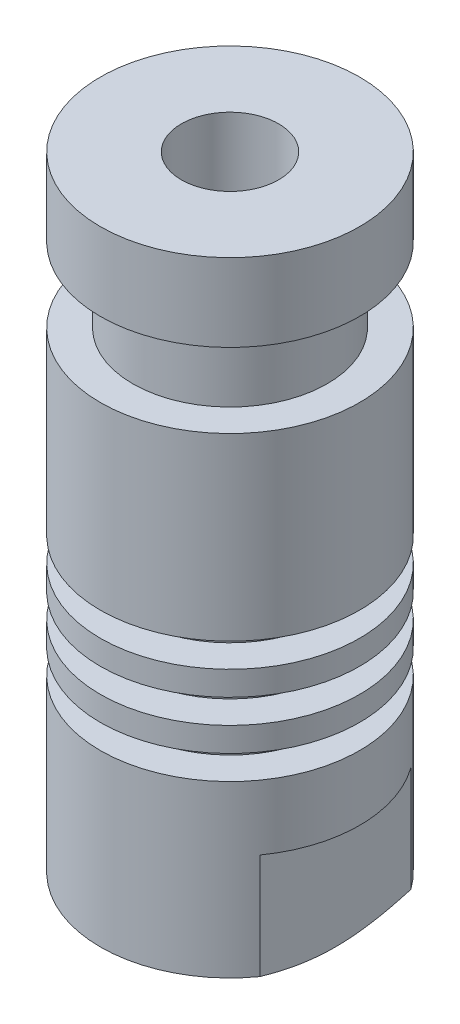
ISO-10303-21;
HEADER;
FILE_DESCRIPTION(('STEP AP214'),'2;1');
FILE_NAME('part.step','',(''),(''),'','','');
FILE_SCHEMA(('AUTOMOTIVE_DESIGN { 1 0 10303 214 1 1 1 1 }'));
ENDSEC;
DATA;
#1=APPLICATION_CONTEXT('core data for automotive mechanical design processes');
#2=APPLICATION_PROTOCOL_DEFINITION('international standard','automotive_design',2000,#1);
#3=PRODUCT_CONTEXT('',#1,'mechanical');
#4=PRODUCT('Part','Part','',(#3));
#5=PRODUCT_RELATED_PRODUCT_CATEGORY('part','',(#4));
#6=PRODUCT_DEFINITION_FORMATION('','',#4);
#7=PRODUCT_DEFINITION_CONTEXT('part definition',#1,'design');
#8=PRODUCT_DEFINITION('design','',#6,#7);
#9=PRODUCT_DEFINITION_SHAPE('','',#8);
#10=(LENGTH_UNIT() NAMED_UNIT(*) SI_UNIT(.MILLI.,.METRE.));
#11=(NAMED_UNIT(*) PLANE_ANGLE_UNIT() SI_UNIT($,.RADIAN.));
#12=(NAMED_UNIT(*) SI_UNIT($,.STERADIAN.) SOLID_ANGLE_UNIT());
#13=UNCERTAINTY_MEASURE_WITH_UNIT(LENGTH_MEASURE(1.E-05),#10,'distance_accuracy_value','');
#14=(GEOMETRIC_REPRESENTATION_CONTEXT(3) GLOBAL_UNCERTAINTY_ASSIGNED_CONTEXT((#13)) GLOBAL_UNIT_ASSIGNED_CONTEXT((#10,
#11,#12)) REPRESENTATION_CONTEXT('',''));
#15=CARTESIAN_POINT('',(0.,0.,0.));
#16=DIRECTION('',(0.,0.,1.));
#17=DIRECTION('',(1.,0.,0.));
#18=AXIS2_PLACEMENT_3D('',#15,#16,#17);
#19=CARTESIAN_POINT('',(0.,1.5,0.));
#20=DIRECTION('',(0.,1.,0.));
#21=DIRECTION('',(0.,0.,1.));
#22=AXIS2_PLACEMENT_3D('',#19,#20,#21);
#23=CONICAL_SURFACE('',#22,7.99999999999999,1.10714871779409);
#24=CARTESIAN_POINT('',(0.,0.,0.));
#25=DIRECTION('',(0.,1.,0.));
#26=DIRECTION('',(0.,0.,1.));
#27=AXIS2_PLACEMENT_3D('',#24,#25,#26);
#28=CIRCLE('',#27,4.99999999999998);
#29=CARTESIAN_POINT('',(0.,0.,4.99999999999998));
#30=VERTEX_POINT('',#29);
#31=EDGE_CURVE('E11',#30,#30,#28,.T.);
#32=ORIENTED_EDGE('',*,*,#31,.T.);
#33=EDGE_LOOP('',(#32));
#34=FACE_BOUND('',#33,.T.);
#35=CARTESIAN_POINT('',(0.,1.5,0.));
#36=DIRECTION('',(0.,1.,0.));
#37=DIRECTION('',(0.,0.,1.));
#38=AXIS2_PLACEMENT_3D('',#35,#36,#37);
#39=CIRCLE('',#38,7.99999999999999);
#40=CARTESIAN_POINT('',(6.49999999999997,1.5,-4.66368952654442));
#41=VERTEX_POINT('',#40);
#42=CARTESIAN_POINT('',(-6.49999999999997,1.5,-4.66368952654442));
#43=VERTEX_POINT('',#42);
#44=EDGE_CURVE('E92',#41,#43,#39,.T.);
#45=ORIENTED_EDGE('',*,*,#44,.F.);
#46=CARTESIAN_POINT('',(6.49999999999999,4.63960517836139,-12.7140020611741));
#47=CARTESIAN_POINT('',(6.49999999999999,4.49493273691476,-12.3889791438294));
#48=CARTESIAN_POINT('',(6.49999999999999,4.35117750702607,-12.0635434352985));
#49=CARTESIAN_POINT('',(6.49999999999999,4.06600795170587,-11.4116234990025));
#50=CARTESIAN_POINT('',(6.49999999999999,3.92459377917146,-11.0851392044028));
#51=CARTESIAN_POINT('',(6.49999999999999,3.64433543055072,-10.4302489102803));
#52=CARTESIAN_POINT('',(6.49999999999999,3.50549732908588,-10.1018403056813));
#53=CARTESIAN_POINT('',(6.49999999999999,3.23142571950738,-9.44352872623451));
#54=CARTESIAN_POINT('',(6.49999999999999,3.09619212071106,-9.11362578922608));
#55=CARTESIAN_POINT('',(6.49999999999999,2.83048289305681,-8.45250376338199));
#56=CARTESIAN_POINT('',(6.49999999999999,2.70000014874712,-8.12128754257229));
#57=CARTESIAN_POINT('',(6.49999999999999,2.44483186701764,-7.45659634827721));
#58=CARTESIAN_POINT('',(6.49999999999999,2.32014667007343,-7.12312124344746));
#59=CARTESIAN_POINT('',(6.49999999999999,2.07840099908305,-6.45372644486896));
#60=CARTESIAN_POINT('',(6.49999999999999,1.96133416663675,-6.11780905674865));
#61=CARTESIAN_POINT('',(6.49999999999999,1.73702665581905,-5.44272397498847));
#62=CARTESIAN_POINT('',(6.49999999999999,1.62978438251793,-5.10355681882979));
#63=CARTESIAN_POINT('',(6.49999999999999,1.50145760944831,-4.66929022803816));
#64=CARTESIAN_POINT('',(6.49999999999999,1.47439812441263,-4.57594563698323));
#65=CARTESIAN_POINT('',(6.49999999999999,1.42132141191772,-4.38896083134469));
#66=CARTESIAN_POINT('',(6.49999999999999,1.39530416853117,-4.29532062130229));
#67=CARTESIAN_POINT('',(6.49999999999999,1.31884649816979,-4.01363447591895));
#68=CARTESIAN_POINT('',(6.49999999999999,1.27009239909997,-3.82513345071698));
#69=CARTESIAN_POINT('',(6.49999999999999,1.13144347216063,-3.25712110004858));
#70=CARTESIAN_POINT('',(6.49999999999999,1.04932049996449,-2.87562365996438));
#71=CARTESIAN_POINT('',(6.49999999999999,0.946261094020701,-2.29977813127616));
#72=CARTESIAN_POINT('',(6.49999999999999,0.915259699355964,-2.10720712065049));
#73=CARTESIAN_POINT('',(6.49999999999999,0.860714592579146,-1.7210183720728));
#74=CARTESIAN_POINT('',(6.49999999999999,0.837170046736164,-1.52740075360301));
#75=CARTESIAN_POINT('',(6.49999999999999,0.798232474629815,-1.13985753736791));
#76=CARTESIAN_POINT('',(6.49999999999999,0.78281812154265,-0.945934097286736));
#77=CARTESIAN_POINT('',(6.49999999999999,0.760510527948946,-0.557594838663115));
#78=CARTESIAN_POINT('',(6.49999999999999,0.753617189046767,-0.363179025832271));
#79=CARTESIAN_POINT('',(6.49999999999999,0.748572275423311,0.0257307608028582));
#80=CARTESIAN_POINT('',(6.49999999999999,0.750419038007415,0.220224712703199));
#81=CARTESIAN_POINT('',(6.49999999999999,0.76278940638265,0.608953775199544));
#82=CARTESIAN_POINT('',(6.49999999999999,0.773314033718197,0.803188852624818));
#83=CARTESIAN_POINT('',(6.49999999999999,0.806501889662758,1.24090602694894));
#84=CARTESIAN_POINT('',(6.49999999999999,0.831590920516132,1.48420561931385));
#85=CARTESIAN_POINT('',(6.49999999999999,0.893852125406738,1.96924724220696));
#86=CARTESIAN_POINT('',(6.49999999999999,0.931025317420885,2.21098913976373));
#87=CARTESIAN_POINT('',(6.49999999999999,1.01604103903786,2.69277716302994));
#88=CARTESIAN_POINT('',(6.49999999999999,1.06389244038228,2.93282170644527));
#89=CARTESIAN_POINT('',(6.49999999999999,1.16871694054054,3.41088019593747));
#90=CARTESIAN_POINT('',(6.49999999999999,1.22568964445531,3.64889422945387));
#91=CARTESIAN_POINT('',(6.49999999999999,1.34820588611418,4.1264246278799));
#92=CARTESIAN_POINT('',(6.49999999999999,1.41386316573231,4.36591159529887));
#93=CARTESIAN_POINT('',(6.49999999999999,1.55170831935892,4.84285142414976));
#94=CARTESIAN_POINT('',(6.49999999999999,1.62389277522808,5.08030527977033));
#95=CARTESIAN_POINT('',(6.49999999999999,1.77367698683179,5.55344813381403));
#96=CARTESIAN_POINT('',(6.49999999999999,1.85127585874315,5.78913741335531));
#97=CARTESIAN_POINT('',(6.49999999999999,2.01097599435672,6.2590172847031));
#98=CARTESIAN_POINT('',(6.49999999999999,2.09307790629008,6.49320765528824));
#99=CARTESIAN_POINT('',(6.49999999999999,2.28703034641471,7.03262988490792));
#100=CARTESIAN_POINT('',(6.49999999999999,2.40021373679549,7.33738166221177));
#101=CARTESIAN_POINT('',(6.49999999999999,2.63161506867892,7.94497276131788));
#102=CARTESIAN_POINT('',(6.49999999999999,2.74983321640616,8.24781200419785));
#103=CARTESIAN_POINT('',(6.49999999999999,2.99028703034095,8.8519169939098));
#104=CARTESIAN_POINT('',(6.49999999999999,3.11252303289466,9.15318260654962));
#105=CARTESIAN_POINT('',(6.49999999999999,3.36022795848007,9.75438363657073));
#106=CARTESIAN_POINT('',(6.49999999999999,3.4856969285348,10.0543190345298));
#107=CARTESIAN_POINT('',(6.49999999999999,3.8662108131295,10.9529295272112));
#108=CARTESIAN_POINT('',(6.49999999999999,4.12517530296346,11.5499439611486));
#109=CARTESIAN_POINT('',(6.49999999999999,4.65016432189855,12.7407935160942));
#110=CARTESIAN_POINT('',(6.49999999999999,4.91618837224115,13.334628849434));
#111=CARTESIAN_POINT('',(6.49999999999999,5.43683739745572,14.4837436524848));
#112=CARTESIAN_POINT('',(6.49999999999999,5.69116368566189,15.0391586745477));
#113=CARTESIAN_POINT('',(6.49999999999999,6.20312748367828,16.148471829484));
#114=CARTESIAN_POINT('',(6.49999999999999,6.46076506083453,16.7023699312269));
#115=CARTESIAN_POINT('',(6.49999999999999,6.97809934492668,17.8080180985776));
#116=CARTESIAN_POINT('',(6.49999999999999,7.23779164660991,18.3597702278274));
#117=CARTESIAN_POINT('',(6.49999999999999,7.75914833515714,19.4623190137403));
#118=CARTESIAN_POINT('',(6.49999999999999,8.02081265352454,20.0131157027799));
#119=CARTESIAN_POINT('',(6.49999999999999,8.28320577924075,20.5635626171586));
#120=B_SPLINE_CURVE_WITH_KNOTS('',3,(#46,#47,#48,#49,#50,#51,#52,#53,#54,#55,#56,#57,#58,#59,
#60,#61,#62,#63,#64,#65,#66,#67,#68,#69,#70,#71,#72,#73,#74,#75,#76,#77,#78,#79,#80,#81,#82,#83,
#84,#85,#86,#87,#88,#89,#90,#91,#92,#93,#94,#95,#96,#97,#98,#99,#100,#101,#102,#103,#104,#105,
#106,#107,#108,#109,#110,#111,#112,#113,#114,#115,#116,#117,#118,#119),.UNSPECIFIED.,.F.,.F.,(4,
2,2,2,2,2,2,2,2,2,2,2,2,2,2,2,2,2,2,2,2,2,2,2,2,2,2,2,2,2,2,2,2,2,2,2,4),(0.,1.06730515758636,
2.13467974924004,3.20431402837474,4.27392137202762,5.34185467005331,6.40985060614333,
7.47694343200912,8.54386271672926,8.83542135077924,9.12697552758702,9.71105511301348,
10.8808525348457,11.4658873460732,12.0508567229673,12.6342839007031,13.2177043413035,
13.8010137979488,14.3843919306593,15.1178129637762,15.8512957967343,16.5853903108169,
17.31945305149,18.0643130987016,18.8087853133975,19.5531362870632,20.2975946957999,
21.2728075860352,22.2480604596634,23.2233951834841,24.1987441014193,26.1509456097113,
28.1030150621006,29.9356240477088,31.7682703646555,33.5977016553135,35.4270696921721),.UNSPECIFIED.);
#121=CARTESIAN_POINT('',(6.49999999999997,1.5,4.66368952654442));
#122=VERTEX_POINT('',#121);
#123=EDGE_CURVE('E77',#122,#41,#120,.F.);
#124=ORIENTED_EDGE('',*,*,#123,.F.);
#125=CARTESIAN_POINT('',(-6.49999999999997,1.5,4.66368952654442));
#126=VERTEX_POINT('',#125);
#127=EDGE_CURVE('E44',#126,#122,#39,.T.);
#128=ORIENTED_EDGE('',*,*,#127,.F.);
#129=CARTESIAN_POINT('',(-6.49999999999999,4.63960517836139,-12.7140020611741));
#130=CARTESIAN_POINT('',(-6.49999999999999,4.49493273691476,-12.3889791438294));
#131=CARTESIAN_POINT('',(-6.49999999999999,4.35117750702607,-12.0635434352985));
#132=CARTESIAN_POINT('',(-6.49999999999999,4.06600795170587,-11.4116234990025));
#133=CARTESIAN_POINT('',(-6.49999999999999,3.92459377917146,-11.0851392044028));
#134=CARTESIAN_POINT('',(-6.49999999999999,3.64433543055072,-10.4302489102803));
#135=CARTESIAN_POINT('',(-6.49999999999999,3.50549732908588,-10.1018403056813));
#136=CARTESIAN_POINT('',(-6.49999999999999,3.23142571950738,-9.44352872623451));
#137=CARTESIAN_POINT('',(-6.49999999999999,3.09619212071106,-9.11362578922608));
#138=CARTESIAN_POINT('',(-6.49999999999999,2.83048289305681,-8.45250376338199));
#139=CARTESIAN_POINT('',(-6.49999999999999,2.70000014874712,-8.12128754257229));
#140=CARTESIAN_POINT('',(-6.49999999999999,2.44483186701764,-7.45659634827721));
#141=CARTESIAN_POINT('',(-6.49999999999999,2.32014667007343,-7.12312124344746));
#142=CARTESIAN_POINT('',(-6.49999999999999,2.07840099908305,-6.45372644486896));
#143=CARTESIAN_POINT('',(-6.49999999999999,1.96133416663675,-6.11780905674865));
#144=CARTESIAN_POINT('',(-6.49999999999999,1.73702665581905,-5.44272397498847));
#145=CARTESIAN_POINT('',(-6.49999999999999,1.62978438251793,-5.10355681882979));
#146=CARTESIAN_POINT('',(-6.49999999999999,1.50145760944831,-4.66929022803816));
#147=CARTESIAN_POINT('',(-6.49999999999999,1.47439812441263,-4.57594563698323));
#148=CARTESIAN_POINT('',(-6.49999999999999,1.42132141191772,-4.38896083134469));
#149=CARTESIAN_POINT('',(-6.49999999999999,1.39530416853117,-4.29532062130229));
#150=CARTESIAN_POINT('',(-6.49999999999999,1.31884649816979,-4.01363447591895));
#151=CARTESIAN_POINT('',(-6.49999999999999,1.27009239909997,-3.82513345071698));
#152=CARTESIAN_POINT('',(-6.49999999999999,1.13144347216063,-3.25712110004858));
#153=CARTESIAN_POINT('',(-6.49999999999999,1.04932049996449,-2.87562365996438));
#154=CARTESIAN_POINT('',(-6.49999999999999,0.946261094020701,-2.29977813127616));
#155=CARTESIAN_POINT('',(-6.49999999999999,0.915259699355964,-2.10720712065049));
#156=CARTESIAN_POINT('',(-6.49999999999999,0.860714592579146,-1.7210183720728));
#157=CARTESIAN_POINT('',(-6.49999999999999,0.837170046736164,-1.52740075360301));
#158=CARTESIAN_POINT('',(-6.49999999999999,0.798232474629815,-1.13985753736791));
#159=CARTESIAN_POINT('',(-6.49999999999999,0.78281812154265,-0.945934097286736));
#160=CARTESIAN_POINT('',(-6.49999999999999,0.760510527948946,-0.557594838663115));
#161=CARTESIAN_POINT('',(-6.49999999999999,0.753617189046767,-0.363179025832271));
#162=CARTESIAN_POINT('',(-6.49999999999999,0.748572275423311,0.0257307608028582));
#163=CARTESIAN_POINT('',(-6.49999999999999,0.750419038007415,0.220224712703199));
#164=CARTESIAN_POINT('',(-6.49999999999999,0.76278940638265,0.608953775199544));
#165=CARTESIAN_POINT('',(-6.49999999999999,0.773314033718197,0.803188852624818));
#166=CARTESIAN_POINT('',(-6.49999999999999,0.806501889662758,1.24090602694894));
#167=CARTESIAN_POINT('',(-6.49999999999999,0.831590920516132,1.48420561931385));
#168=CARTESIAN_POINT('',(-6.49999999999999,0.893852125406738,1.96924724220696));
#169=CARTESIAN_POINT('',(-6.49999999999999,0.931025317420885,2.21098913976373));
#170=CARTESIAN_POINT('',(-6.49999999999999,1.01604103903786,2.69277716302994));
#171=CARTESIAN_POINT('',(-6.49999999999999,1.06389244038228,2.93282170644527));
#172=CARTESIAN_POINT('',(-6.49999999999999,1.16871694054054,3.41088019593747));
#173=CARTESIAN_POINT('',(-6.49999999999999,1.22568964445531,3.64889422945387));
#174=CARTESIAN_POINT('',(-6.49999999999999,1.34820588611418,4.1264246278799));
#175=CARTESIAN_POINT('',(-6.49999999999999,1.41386316573231,4.36591159529887));
#176=CARTESIAN_POINT('',(-6.49999999999999,1.55170831935892,4.84285142414976));
#177=CARTESIAN_POINT('',(-6.49999999999999,1.62389277522808,5.08030527977033));
#178=CARTESIAN_POINT('',(-6.49999999999999,1.77367698683179,5.55344813381403));
#179=CARTESIAN_POINT('',(-6.49999999999999,1.85127585874315,5.78913741335531));
#180=CARTESIAN_POINT('',(-6.49999999999999,2.01097599435672,6.2590172847031));
#181=CARTESIAN_POINT('',(-6.49999999999999,2.09307790629008,6.49320765528824));
#182=CARTESIAN_POINT('',(-6.49999999999999,2.28703034641471,7.03262988490792));
#183=CARTESIAN_POINT('',(-6.49999999999999,2.40021373679549,7.33738166221177));
#184=CARTESIAN_POINT('',(-6.49999999999999,2.63161506867892,7.94497276131788));
#185=CARTESIAN_POINT('',(-6.49999999999999,2.74983321640616,8.24781200419785));
#186=CARTESIAN_POINT('',(-6.49999999999999,2.99028703034095,8.8519169939098));
#187=CARTESIAN_POINT('',(-6.49999999999999,3.11252303289466,9.15318260654962));
#188=CARTESIAN_POINT('',(-6.49999999999999,3.36022795848007,9.75438363657073));
#189=CARTESIAN_POINT('',(-6.49999999999999,3.4856969285348,10.0543190345298));
#190=CARTESIAN_POINT('',(-6.49999999999999,3.8662108131295,10.9529295272112));
#191=CARTESIAN_POINT('',(-6.49999999999999,4.12517530296346,11.5499439611486));
#192=CARTESIAN_POINT('',(-6.49999999999999,4.65016432189855,12.7407935160942));
#193=CARTESIAN_POINT('',(-6.49999999999999,4.91618837224115,13.334628849434));
#194=CARTESIAN_POINT('',(-6.49999999999999,5.43683739745572,14.4837436524848));
#195=CARTESIAN_POINT('',(-6.49999999999999,5.69116368566189,15.0391586745477));
#196=CARTESIAN_POINT('',(-6.49999999999999,6.20312748367828,16.148471829484));
#197=CARTESIAN_POINT('',(-6.49999999999999,6.46076506083453,16.7023699312269));
#198=CARTESIAN_POINT('',(-6.49999999999999,6.97809934492668,17.8080180985776));
#199=CARTESIAN_POINT('',(-6.49999999999999,7.23779164660991,18.3597702278274));
#200=CARTESIAN_POINT('',(-6.49999999999999,7.75914833515714,19.4623190137403));
#201=CARTESIAN_POINT('',(-6.49999999999999,8.02081265352454,20.0131157027799));
#202=CARTESIAN_POINT('',(-6.49999999999999,8.28320577924075,20.5635626171586));
#203=B_SPLINE_CURVE_WITH_KNOTS('',3,(#129,#130,#131,#132,#133,#134,#135,#136,#137,#138,#139,
#140,#141,#142,#143,#144,#145,#146,#147,#148,#149,#150,#151,#152,#153,#154,#155,#156,#157,#158,
#159,#160,#161,#162,#163,#164,#165,#166,#167,#168,#169,#170,#171,#172,#173,#174,#175,#176,#177,
#178,#179,#180,#181,#182,#183,#184,#185,#186,#187,#188,#189,#190,#191,#192,#193,#194,#195,#196,
#197,#198,#199,#200,#201,#202),.UNSPECIFIED.,.F.,.F.,(4,2,2,2,2,2,2,2,2,2,2,2,2,2,2,2,2,2,2,2,2,
2,2,2,2,2,2,2,2,2,2,2,2,2,2,2,4),(0.,1.06730515758636,2.13467974924004,3.20431402837474,
4.27392137202762,5.34185467005331,6.40985060614333,7.47694343200912,8.54386271672926,
8.83542135077924,9.12697552758702,9.71105511301348,10.8808525348457,11.4658873460732,
12.0508567229673,12.6342839007031,13.2177043413035,13.8010137979488,14.3843919306593,
15.1178129637762,15.8512957967343,16.5853903108169,17.31945305149,18.0643130987016,
18.8087853133975,19.5531362870632,20.2975946957999,21.2728075860352,22.2480604596634,
23.2233951834841,24.1987441014193,26.1509456097113,28.1030150621006,29.9356240477088,
31.7682703646555,33.5977016553135,35.4270696921721),.UNSPECIFIED.);
#204=EDGE_CURVE('E97',#43,#126,#203,.T.);
#205=ORIENTED_EDGE('',*,*,#204,.F.);
#206=EDGE_LOOP('',(#45,#124,#128,#205));
#207=FACE_BOUND('',#206,.T.);
#208=ADVANCED_FACE('F35',(#34,#207),#23,.T.);
#209=CARTESIAN_POINT('',(0.,129.407380346339,0.));
#210=DIRECTION('',(0.,1.,0.));
#211=DIRECTION('',(0.,0.,1.));
#212=AXIS2_PLACEMENT_3D('',#209,#210,#211);
#213=CYLINDRICAL_SURFACE('',#212,7.99999999999999);
#214=CARTESIAN_POINT('',(0.,12.,0.));
#215=DIRECTION('',(0.,1.,0.));
#216=DIRECTION('',(0.,0.,1.));
#217=AXIS2_PLACEMENT_3D('',#214,#215,#216);
#218=CIRCLE('',#217,7.99999999999998);
#219=CARTESIAN_POINT('',(0.,12.,7.99999999999998));
#220=VERTEX_POINT('',#219);
#221=EDGE_CURVE('E98',#220,#220,#218,.T.);
#222=ORIENTED_EDGE('',*,*,#221,.F.);
#223=EDGE_LOOP('',(#222));
#224=FACE_BOUND('',#223,.T.);
#225=CARTESIAN_POINT('',(0.,7.99999999999999,0.));
#226=DIRECTION('',(0.,-1.,0.));
#227=DIRECTION('',(0.,0.,-1.));
#228=AXIS2_PLACEMENT_3D('',#225,#226,#227);
#229=CIRCLE('',#228,7.99999999999999);
#230=CARTESIAN_POINT('',(6.49999999999999,7.99999999999999,-4.6636895265444));
#231=VERTEX_POINT('',#230);
#232=CARTESIAN_POINT('',(6.49999999999997,7.99999999999999,4.66368952654442));
#233=VERTEX_POINT('',#232);
#234=EDGE_CURVE('E50',#231,#233,#229,.T.);
#235=ORIENTED_EDGE('',*,*,#234,.F.);
#236=DIRECTION('',(0.,1.,0.));
#237=VECTOR('',#236,1.);
#238=CARTESIAN_POINT('',(6.49999999999997,129.407380346339,-4.66368952654442));
#239=LINE('',#238,#237);
#240=EDGE_CURVE('E80',#231,#41,#239,.F.);
#241=ORIENTED_EDGE('',*,*,#240,.T.);
#242=ORIENTED_EDGE('',*,*,#44,.T.);
#243=DIRECTION('',(0.,1.,0.));
#244=VECTOR('',#243,1.);
#245=CARTESIAN_POINT('',(-6.49999999999997,129.407380346339,-4.66368952654442));
#246=LINE('',#245,#244);
#247=CARTESIAN_POINT('',(-6.49999999999999,7.99999999999999,-4.6636895265444));
#248=VERTEX_POINT('',#247);
#249=EDGE_CURVE('E456',#43,#248,#246,.T.);
#250=ORIENTED_EDGE('',*,*,#249,.T.);
#251=CARTESIAN_POINT('',(0.,7.99999999999998,0.));
#252=DIRECTION('',(0.,-1.,0.));
#253=DIRECTION('',(1.,0.,0.));
#254=AXIS2_PLACEMENT_3D('',#251,#252,#253);
#255=CIRCLE('',#254,7.99999999999999);
#256=CARTESIAN_POINT('',(-6.49999999999999,7.99999999999999,4.6636895265444));
#257=VERTEX_POINT('',#256);
#258=EDGE_CURVE('E457',#257,#248,#255,.T.);
#259=ORIENTED_EDGE('',*,*,#258,.F.);
#260=DIRECTION('',(0.,1.,0.));
#261=VECTOR('',#260,1.);
#262=CARTESIAN_POINT('',(-6.49999999999997,129.407380346339,4.66368952654442));
#263=LINE('',#262,#261);
#264=EDGE_CURVE('E58',#126,#257,#263,.T.);
#265=ORIENTED_EDGE('',*,*,#264,.F.);
#266=ORIENTED_EDGE('',*,*,#127,.T.);
#267=DIRECTION('',(0.,1.,0.));
#268=VECTOR('',#267,1.);
#269=CARTESIAN_POINT('',(6.49999999999997,129.407380346339,4.66368952654442));
#270=LINE('',#269,#268);
#271=EDGE_CURVE('E82',#233,#122,#270,.F.);
#272=ORIENTED_EDGE('',*,*,#271,.F.);
#273=EDGE_LOOP('',(#235,#241,#242,#250,#259,#265,#266,#272));
#274=FACE_BOUND('',#273,.T.);
#275=ADVANCED_FACE('F90',(#224,#274),#213,.T.);
#276=CARTESIAN_POINT('',(0.,0.,0.));
#277=DIRECTION('',(0.,-1.,0.));
#278=DIRECTION('',(0.,0.,-1.));
#279=AXIS2_PLACEMENT_3D('',#276,#277,#278);
#280=PLANE('',#279);
#281=CARTESIAN_POINT('',(0.,0.,0.));
#282=DIRECTION('',(0.,-1.,0.));
#283=DIRECTION('',(0.,0.,-1.));
#284=AXIS2_PLACEMENT_3D('',#281,#282,#283);
#285=CIRCLE('',#284,3.39999999999999);
#286=CARTESIAN_POINT('',(0.,0.,-3.39999999999999));
#287=VERTEX_POINT('',#286);
#288=EDGE_CURVE('E297',#287,#287,#285,.T.);
#289=ORIENTED_EDGE('',*,*,#288,.F.);
#290=EDGE_LOOP('',(#289));
#291=FACE_BOUND('',#290,.T.);
#292=ORIENTED_EDGE('',*,*,#31,.F.);
#293=EDGE_LOOP('',(#292));
#294=FACE_BOUND('',#293,.T.);
#295=ADVANCED_FACE('F37',(#291,#294),#280,.T.);
#296=CARTESIAN_POINT('',(-7.99999999999998,12.,0.));
#297=DIRECTION('',(0.,1.,0.));
#298=DIRECTION('',(0.,0.,1.));
#299=AXIS2_PLACEMENT_3D('',#296,#297,#298);
#300=PLANE('',#299);
#301=ORIENTED_EDGE('',*,*,#221,.T.);
#302=EDGE_LOOP('',(#301));
#303=FACE_BOUND('',#302,.T.);
#304=CARTESIAN_POINT('',(0.,12.,0.));
#305=DIRECTION('',(0.,1.,0.));
#306=DIRECTION('',(0.,0.,1.));
#307=AXIS2_PLACEMENT_3D('',#304,#305,#306);
#308=CIRCLE('',#307,5.99999999999999);
#309=CARTESIAN_POINT('',(0.,12.,5.99999999999999));
#310=VERTEX_POINT('',#309);
#311=EDGE_CURVE('E101',#310,#310,#308,.T.);
#312=ORIENTED_EDGE('',*,*,#311,.F.);
#313=EDGE_LOOP('',(#312));
#314=FACE_BOUND('',#313,.T.);
#315=ADVANCED_FACE('F185',(#303,#314),#300,.T.);
#316=CARTESIAN_POINT('',(0.,129.407380346339,0.));
#317=DIRECTION('',(0.,1.,0.));
#318=DIRECTION('',(0.,0.,1.));
#319=AXIS2_PLACEMENT_3D('',#316,#317,#318);
#320=CYLINDRICAL_SURFACE('',#319,5.99999999999999);
#321=ORIENTED_EDGE('',*,*,#311,.T.);
#322=EDGE_LOOP('',(#321));
#323=FACE_BOUND('',#322,.T.);
#324=CARTESIAN_POINT('',(0.,13.5,0.));
#325=DIRECTION('',(0.,1.,0.));
#326=DIRECTION('',(0.,0.,1.));
#327=AXIS2_PLACEMENT_3D('',#324,#325,#326);
#328=CIRCLE('',#327,5.99999999999999);
#329=CARTESIAN_POINT('',(0.,13.5,5.99999999999999));
#330=VERTEX_POINT('',#329);
#331=EDGE_CURVE('E106',#330,#330,#328,.T.);
#332=ORIENTED_EDGE('',*,*,#331,.F.);
#333=EDGE_LOOP('',(#332));
#334=FACE_BOUND('',#333,.T.);
#335=ADVANCED_FACE('F188',(#323,#334),#320,.T.);
#336=CARTESIAN_POINT('',(-5.99999999999999,13.5,0.));
#337=DIRECTION('',(0.,-1.,0.));
#338=DIRECTION('',(0.,0.,-1.));
#339=AXIS2_PLACEMENT_3D('',#336,#337,#338);
#340=PLANE('',#339);
#341=ORIENTED_EDGE('',*,*,#331,.T.);
#342=EDGE_LOOP('',(#341));
#343=FACE_BOUND('',#342,.T.);
#344=CARTESIAN_POINT('',(0.,13.5,0.));
#345=DIRECTION('',(0.,1.,0.));
#346=DIRECTION('',(0.,0.,1.));
#347=AXIS2_PLACEMENT_3D('',#344,#345,#346);
#348=CIRCLE('',#347,8.);
#349=CARTESIAN_POINT('',(0.,13.5,8.));
#350=VERTEX_POINT('',#349);
#351=EDGE_CURVE('E109',#350,#350,#348,.T.);
#352=ORIENTED_EDGE('',*,*,#351,.F.);
#353=EDGE_LOOP('',(#352));
#354=FACE_BOUND('',#353,.T.);
#355=ADVANCED_FACE('F192',(#343,#354),#340,.T.);
#356=CARTESIAN_POINT('',(0.,129.407380346339,0.));
#357=DIRECTION('',(0.,1.,0.));
#358=DIRECTION('',(0.,0.,1.));
#359=AXIS2_PLACEMENT_3D('',#356,#357,#358);
#360=CYLINDRICAL_SURFACE('',#359,8.);
#361=ORIENTED_EDGE('',*,*,#351,.T.);
#362=EDGE_LOOP('',(#361));
#363=FACE_BOUND('',#362,.T.);
#364=CARTESIAN_POINT('',(0.,15.,0.));
#365=DIRECTION('',(0.,1.,0.));
#366=DIRECTION('',(0.,0.,1.));
#367=AXIS2_PLACEMENT_3D('',#364,#365,#366);
#368=CIRCLE('',#367,8.);
#369=CARTESIAN_POINT('',(0.,15.,8.));
#370=VERTEX_POINT('',#369);
#371=EDGE_CURVE('E112',#370,#370,#368,.T.);
#372=ORIENTED_EDGE('',*,*,#371,.F.);
#373=EDGE_LOOP('',(#372));
#374=FACE_BOUND('',#373,.T.);
#375=ADVANCED_FACE('F196',(#363,#374),#360,.T.);
#376=CARTESIAN_POINT('',(-8.,15.,0.));
#377=DIRECTION('',(0.,1.,0.));
#378=DIRECTION('',(0.,0.,1.));
#379=AXIS2_PLACEMENT_3D('',#376,#377,#378);
#380=PLANE('',#379);
#381=ORIENTED_EDGE('',*,*,#371,.T.);
#382=EDGE_LOOP('',(#381));
#383=FACE_BOUND('',#382,.T.);
#384=CARTESIAN_POINT('',(0.,15.,0.));
#385=DIRECTION('',(0.,1.,0.));
#386=DIRECTION('',(0.,0.,1.));
#387=AXIS2_PLACEMENT_3D('',#384,#385,#386);
#388=CIRCLE('',#387,6.);
#389=CARTESIAN_POINT('',(0.,15.,6.));
#390=VERTEX_POINT('',#389);
#391=EDGE_CURVE('E115',#390,#390,#388,.T.);
#392=ORIENTED_EDGE('',*,*,#391,.F.);
#393=EDGE_LOOP('',(#392));
#394=FACE_BOUND('',#393,.T.);
#395=ADVANCED_FACE('F200',(#383,#394),#380,.T.);
#396=CARTESIAN_POINT('',(0.,129.407380346339,0.));
#397=DIRECTION('',(0.,1.,0.));
#398=DIRECTION('',(0.,0.,1.));
#399=AXIS2_PLACEMENT_3D('',#396,#397,#398);
#400=CYLINDRICAL_SURFACE('',#399,6.);
#401=ORIENTED_EDGE('',*,*,#391,.T.);
#402=EDGE_LOOP('',(#401));
#403=FACE_BOUND('',#402,.T.);
#404=CARTESIAN_POINT('',(0.,16.5,0.));
#405=DIRECTION('',(0.,1.,0.));
#406=DIRECTION('',(0.,0.,1.));
#407=AXIS2_PLACEMENT_3D('',#404,#405,#406);
#408=CIRCLE('',#407,6.);
#409=CARTESIAN_POINT('',(0.,16.5,6.));
#410=VERTEX_POINT('',#409);
#411=EDGE_CURVE('E118',#410,#410,#408,.T.);
#412=ORIENTED_EDGE('',*,*,#411,.F.);
#413=EDGE_LOOP('',(#412));
#414=FACE_BOUND('',#413,.T.);
#415=ADVANCED_FACE('F204',(#403,#414),#400,.T.);
#416=CARTESIAN_POINT('',(-6.,16.5,0.));
#417=DIRECTION('',(0.,-1.,0.));
#418=DIRECTION('',(0.,0.,-1.));
#419=AXIS2_PLACEMENT_3D('',#416,#417,#418);
#420=PLANE('',#419);
#421=ORIENTED_EDGE('',*,*,#411,.T.);
#422=EDGE_LOOP('',(#421));
#423=FACE_BOUND('',#422,.T.);
#424=CARTESIAN_POINT('',(0.,16.5,0.));
#425=DIRECTION('',(0.,1.,0.));
#426=DIRECTION('',(0.,0.,1.));
#427=AXIS2_PLACEMENT_3D('',#424,#425,#426);
#428=CIRCLE('',#427,8.);
#429=CARTESIAN_POINT('',(0.,16.5,8.));
#430=VERTEX_POINT('',#429);
#431=EDGE_CURVE('E121',#430,#430,#428,.T.);
#432=ORIENTED_EDGE('',*,*,#431,.F.);
#433=EDGE_LOOP('',(#432));
#434=FACE_BOUND('',#433,.T.);
#435=ADVANCED_FACE('F208',(#423,#434),#420,.T.);
#436=CARTESIAN_POINT('',(0.,129.407380346339,0.));
#437=DIRECTION('',(0.,1.,0.));
#438=DIRECTION('',(0.,0.,1.));
#439=AXIS2_PLACEMENT_3D('',#436,#437,#438);
#440=CYLINDRICAL_SURFACE('',#439,8.);
#441=ORIENTED_EDGE('',*,*,#431,.T.);
#442=EDGE_LOOP('',(#441));
#443=FACE_BOUND('',#442,.T.);
#444=CARTESIAN_POINT('',(0.,18.,0.));
#445=DIRECTION('',(0.,1.,0.));
#446=DIRECTION('',(0.,0.,1.));
#447=AXIS2_PLACEMENT_3D('',#444,#445,#446);
#448=CIRCLE('',#447,8.);
#449=CARTESIAN_POINT('',(0.,18.,8.));
#450=VERTEX_POINT('',#449);
#451=EDGE_CURVE('E124',#450,#450,#448,.T.);
#452=ORIENTED_EDGE('',*,*,#451,.F.);
#453=EDGE_LOOP('',(#452));
#454=FACE_BOUND('',#453,.T.);
#455=ADVANCED_FACE('F212',(#443,#454),#440,.T.);
#456=CARTESIAN_POINT('',(-8.,18.,0.));
#457=DIRECTION('',(0.,1.,0.));
#458=DIRECTION('',(0.,0.,1.));
#459=AXIS2_PLACEMENT_3D('',#456,#457,#458);
#460=PLANE('',#459);
#461=ORIENTED_EDGE('',*,*,#451,.T.);
#462=EDGE_LOOP('',(#461));
#463=FACE_BOUND('',#462,.T.);
#464=CARTESIAN_POINT('',(0.,18.,0.));
#465=DIRECTION('',(0.,1.,0.));
#466=DIRECTION('',(0.,0.,1.));
#467=AXIS2_PLACEMENT_3D('',#464,#465,#466);
#468=CIRCLE('',#467,6.);
#469=CARTESIAN_POINT('',(0.,18.,6.));
#470=VERTEX_POINT('',#469);
#471=EDGE_CURVE('E127',#470,#470,#468,.T.);
#472=ORIENTED_EDGE('',*,*,#471,.F.);
#473=EDGE_LOOP('',(#472));
#474=FACE_BOUND('',#473,.T.);
#475=ADVANCED_FACE('F216',(#463,#474),#460,.T.);
#476=CARTESIAN_POINT('',(0.,129.407380346339,0.));
#477=DIRECTION('',(0.,1.,0.));
#478=DIRECTION('',(0.,0.,1.));
#479=AXIS2_PLACEMENT_3D('',#476,#477,#478);
#480=CYLINDRICAL_SURFACE('',#479,6.);
#481=ORIENTED_EDGE('',*,*,#471,.T.);
#482=EDGE_LOOP('',(#481));
#483=FACE_BOUND('',#482,.T.);
#484=CARTESIAN_POINT('',(0.,19.5,0.));
#485=DIRECTION('',(0.,1.,0.));
#486=DIRECTION('',(0.,0.,1.));
#487=AXIS2_PLACEMENT_3D('',#484,#485,#486);
#488=CIRCLE('',#487,6.);
#489=CARTESIAN_POINT('',(0.,19.5,6.));
#490=VERTEX_POINT('',#489);
#491=EDGE_CURVE('E130',#490,#490,#488,.T.);
#492=ORIENTED_EDGE('',*,*,#491,.F.);
#493=EDGE_LOOP('',(#492));
#494=FACE_BOUND('',#493,.T.);
#495=ADVANCED_FACE('F220',(#483,#494),#480,.T.);
#496=CARTESIAN_POINT('',(-6.,19.5,0.));
#497=DIRECTION('',(0.,-1.,0.));
#498=DIRECTION('',(0.,0.,-1.));
#499=AXIS2_PLACEMENT_3D('',#496,#497,#498);
#500=PLANE('',#499);
#501=ORIENTED_EDGE('',*,*,#491,.T.);
#502=EDGE_LOOP('',(#501));
#503=FACE_BOUND('',#502,.T.);
#504=CARTESIAN_POINT('',(0.,19.5,0.));
#505=DIRECTION('',(0.,1.,0.));
#506=DIRECTION('',(0.,0.,1.));
#507=AXIS2_PLACEMENT_3D('',#504,#505,#506);
#508=CIRCLE('',#507,8.);
#509=CARTESIAN_POINT('',(0.,19.5,8.));
#510=VERTEX_POINT('',#509);
#511=EDGE_CURVE('E133',#510,#510,#508,.T.);
#512=ORIENTED_EDGE('',*,*,#511,.F.);
#513=EDGE_LOOP('',(#512));
#514=FACE_BOUND('',#513,.T.);
#515=ADVANCED_FACE('F224',(#503,#514),#500,.T.);
#516=CARTESIAN_POINT('',(0.,129.407380346339,0.));
#517=DIRECTION('',(0.,1.,0.));
#518=DIRECTION('',(0.,0.,1.));
#519=AXIS2_PLACEMENT_3D('',#516,#517,#518);
#520=CYLINDRICAL_SURFACE('',#519,8.);
#521=ORIENTED_EDGE('',*,*,#511,.T.);
#522=EDGE_LOOP('',(#521));
#523=FACE_BOUND('',#522,.T.);
#524=CARTESIAN_POINT('',(0.,30.6,0.));
#525=DIRECTION('',(0.,1.,0.));
#526=DIRECTION('',(0.,0.,1.));
#527=AXIS2_PLACEMENT_3D('',#524,#525,#526);
#528=CIRCLE('',#527,8.);
#529=CARTESIAN_POINT('',(0.,30.6,8.));
#530=VERTEX_POINT('',#529);
#531=EDGE_CURVE('E136',#530,#530,#528,.T.);
#532=ORIENTED_EDGE('',*,*,#531,.F.);
#533=EDGE_LOOP('',(#532));
#534=FACE_BOUND('',#533,.T.);
#535=ADVANCED_FACE('F228',(#523,#534),#520,.T.);
#536=CARTESIAN_POINT('',(-8.,30.6,0.));
#537=DIRECTION('',(0.,1.,0.));
#538=DIRECTION('',(0.,0.,1.));
#539=AXIS2_PLACEMENT_3D('',#536,#537,#538);
#540=PLANE('',#539);
#541=ORIENTED_EDGE('',*,*,#531,.T.);
#542=EDGE_LOOP('',(#541));
#543=FACE_BOUND('',#542,.T.);
#544=CARTESIAN_POINT('',(0.,30.6,0.));
#545=DIRECTION('',(0.,1.,0.));
#546=DIRECTION('',(0.,0.,1.));
#547=AXIS2_PLACEMENT_3D('',#544,#545,#546);
#548=CIRCLE('',#547,6.);
#549=CARTESIAN_POINT('',(0.,30.6,6.));
#550=VERTEX_POINT('',#549);
#551=EDGE_CURVE('E139',#550,#550,#548,.T.);
#552=ORIENTED_EDGE('',*,*,#551,.F.);
#553=EDGE_LOOP('',(#552));
#554=FACE_BOUND('',#553,.T.);
#555=ADVANCED_FACE('F232',(#543,#554),#540,.T.);
#556=CARTESIAN_POINT('',(0.,129.407380346339,0.));
#557=DIRECTION('',(0.,1.,0.));
#558=DIRECTION('',(0.,0.,1.));
#559=AXIS2_PLACEMENT_3D('',#556,#557,#558);
#560=CYLINDRICAL_SURFACE('',#559,6.);
#561=ORIENTED_EDGE('',*,*,#551,.T.);
#562=EDGE_LOOP('',(#561));
#563=FACE_BOUND('',#562,.T.);
#564=CARTESIAN_POINT('',(0.,35.2,0.));
#565=DIRECTION('',(0.,1.,0.));
#566=DIRECTION('',(0.,0.,1.));
#567=AXIS2_PLACEMENT_3D('',#564,#565,#566);
#568=CIRCLE('',#567,6.);
#569=CARTESIAN_POINT('',(0.,35.2,6.));
#570=VERTEX_POINT('',#569);
#571=EDGE_CURVE('E142',#570,#570,#568,.T.);
#572=ORIENTED_EDGE('',*,*,#571,.F.);
#573=EDGE_LOOP('',(#572));
#574=FACE_BOUND('',#573,.T.);
#575=ADVANCED_FACE('F236',(#563,#574),#560,.T.);
#576=CARTESIAN_POINT('',(-6.,35.2,0.));
#577=DIRECTION('',(0.,-1.,0.));
#578=DIRECTION('',(0.,0.,-1.));
#579=AXIS2_PLACEMENT_3D('',#576,#577,#578);
#580=PLANE('',#579);
#581=ORIENTED_EDGE('',*,*,#571,.T.);
#582=EDGE_LOOP('',(#581));
#583=FACE_BOUND('',#582,.T.);
#584=CARTESIAN_POINT('',(0.,35.2,0.));
#585=DIRECTION('',(0.,1.,0.));
#586=DIRECTION('',(0.,0.,1.));
#587=AXIS2_PLACEMENT_3D('',#584,#585,#586);
#588=CIRCLE('',#587,8.);
#589=CARTESIAN_POINT('',(0.,35.2,8.));
#590=VERTEX_POINT('',#589);
#591=EDGE_CURVE('E145',#590,#590,#588,.T.);
#592=ORIENTED_EDGE('',*,*,#591,.F.);
#593=EDGE_LOOP('',(#592));
#594=FACE_BOUND('',#593,.T.);
#595=ADVANCED_FACE('F240',(#583,#594),#580,.T.);
#596=CARTESIAN_POINT('',(0.,129.407380346339,0.));
#597=DIRECTION('',(0.,1.,0.));
#598=DIRECTION('',(0.,0.,1.));
#599=AXIS2_PLACEMENT_3D('',#596,#597,#598);
#600=CYLINDRICAL_SURFACE('',#599,7.99999999999999);
#601=ORIENTED_EDGE('',*,*,#591,.T.);
#602=EDGE_LOOP('',(#601));
#603=FACE_BOUND('',#602,.T.);
#604=CARTESIAN_POINT('',(0.,40.,0.));
#605=DIRECTION('',(0.,1.,0.));
#606=DIRECTION('',(0.,0.,1.));
#607=AXIS2_PLACEMENT_3D('',#604,#605,#606);
#608=CIRCLE('',#607,7.99999999999998);
#609=CARTESIAN_POINT('',(0.,40.,7.99999999999998));
#610=VERTEX_POINT('',#609);
#611=EDGE_CURVE('E148',#610,#610,#608,.T.);
#612=ORIENTED_EDGE('',*,*,#611,.F.);
#613=EDGE_LOOP('',(#612));
#614=FACE_BOUND('',#613,.T.);
#615=ADVANCED_FACE('F244',(#603,#614),#600,.T.);
#616=CARTESIAN_POINT('',(-7.99999999999998,40.,0.));
#617=DIRECTION('',(0.,1.,0.));
#618=DIRECTION('',(0.,0.,1.));
#619=AXIS2_PLACEMENT_3D('',#616,#617,#618);
#620=PLANE('',#619);
#621=CARTESIAN_POINT('',(0.,40.,0.));
#622=DIRECTION('',(0.,1.,0.));
#623=DIRECTION('',(0.,0.,1.));
#624=AXIS2_PLACEMENT_3D('',#621,#622,#623);
#625=CIRCLE('',#624,3.);
#626=CARTESIAN_POINT('',(0.,40.,3.));
#627=VERTEX_POINT('',#626);
#628=EDGE_CURVE('E94',#627,#627,#625,.T.);
#629=ORIENTED_EDGE('',*,*,#628,.F.);
#630=EDGE_LOOP('',(#629));
#631=FACE_BOUND('',#630,.T.);
#632=ORIENTED_EDGE('',*,*,#611,.T.);
#633=EDGE_LOOP('',(#632));
#634=FACE_BOUND('',#633,.T.);
#635=ADVANCED_FACE('F175',(#631,#634),#620,.T.);
#636=CARTESIAN_POINT('',(-6.49999999999999,7.99999999999999,8.001));
#637=DIRECTION('',(-1.,0.,0.));
#638=DIRECTION('',(0.,-1.,0.));
#639=AXIS2_PLACEMENT_3D('',#636,#637,#638);
#640=PLANE('',#639);
#641=ORIENTED_EDGE('',*,*,#204,.T.);
#642=ORIENTED_EDGE('',*,*,#264,.T.);
#643=DIRECTION('',(0.,0.,-1.));
#644=VECTOR('',#643,1.);
#645=CARTESIAN_POINT('',(-6.49999999999999,7.99999999999999,8.001));
#646=LINE('',#645,#644);
#647=EDGE_CURVE('E151',#257,#248,#646,.T.);
#648=ORIENTED_EDGE('',*,*,#647,.T.);
#649=ORIENTED_EDGE('',*,*,#249,.F.);
#650=EDGE_LOOP('',(#641,#642,#648,#649));
#651=FACE_BOUND('',#650,.T.);
#652=ADVANCED_FACE('F160',(#651),#640,.T.);
#653=CARTESIAN_POINT('',(-7.99999999999999,7.99999999999999,8.001));
#654=DIRECTION('',(0.,-1.,0.));
#655=DIRECTION('',(1.,0.,0.));
#656=AXIS2_PLACEMENT_3D('',#653,#654,#655);
#657=PLANE('',#656);
#658=ORIENTED_EDGE('',*,*,#258,.T.);
#659=ORIENTED_EDGE('',*,*,#647,.F.);
#660=EDGE_LOOP('',(#658,#659));
#661=FACE_BOUND('',#660,.T.);
#662=ADVANCED_FACE('F168',(#661),#657,.T.);
#663=CARTESIAN_POINT('',(7.99999999999999,7.99999999999999,8.001));
#664=DIRECTION('',(0.,-1.,0.));
#665=DIRECTION('',(0.,0.,-1.));
#666=AXIS2_PLACEMENT_3D('',#663,#664,#665);
#667=PLANE('',#666);
#668=ORIENTED_EDGE('',*,*,#234,.T.);
#669=DIRECTION('',(0.,0.,-1.));
#670=VECTOR('',#669,1.);
#671=CARTESIAN_POINT('',(6.49999999999999,7.99999999999999,8.001));
#672=LINE('',#671,#670);
#673=EDGE_CURVE('E87',#233,#231,#672,.T.);
#674=ORIENTED_EDGE('',*,*,#673,.T.);
#675=EDGE_LOOP('',(#668,#674));
#676=FACE_BOUND('',#675,.T.);
#677=ADVANCED_FACE('F166',(#676),#667,.T.);
#678=CARTESIAN_POINT('',(6.49999999999999,7.99999999999999,8.001));
#679=DIRECTION('',(1.,0.,0.));
#680=DIRECTION('',(0.,1.,0.));
#681=AXIS2_PLACEMENT_3D('',#678,#679,#680);
#682=PLANE('',#681);
#683=ORIENTED_EDGE('',*,*,#123,.T.);
#684=ORIENTED_EDGE('',*,*,#240,.F.);
#685=ORIENTED_EDGE('',*,*,#673,.F.);
#686=ORIENTED_EDGE('',*,*,#271,.T.);
#687=EDGE_LOOP('',(#683,#684,#685,#686));
#688=FACE_BOUND('',#687,.T.);
#689=ADVANCED_FACE('F79',(#688),#682,.T.);
#690=CARTESIAN_POINT('',(0.,0.,0.));
#691=DIRECTION('',(0.,1.,0.));
#692=DIRECTION('',(0.,0.,1.));
#693=AXIS2_PLACEMENT_3D('',#690,#691,#692);
#694=CYLINDRICAL_SURFACE('',#693,3.);
#695=CARTESIAN_POINT('',(0.,12.240344247611,0.));
#696=DIRECTION('',(0.,-1.,0.));
#697=DIRECTION('',(0.,0.,-1.));
#698=AXIS2_PLACEMENT_3D('',#695,#696,#697);
#699=CIRCLE('',#698,3.);
#700=CARTESIAN_POINT('',(0.,12.240344247611,-3.));
#701=VERTEX_POINT('',#700);
#702=EDGE_CURVE('E39',#701,#701,#699,.T.);
#703=ORIENTED_EDGE('',*,*,#702,.T.);
#704=EDGE_LOOP('',(#703));
#705=FACE_BOUND('',#704,.T.);
#706=ORIENTED_EDGE('',*,*,#628,.T.);
#707=EDGE_LOOP('',(#706));
#708=FACE_BOUND('',#707,.T.);
#709=ADVANCED_FACE('F275',(#705,#708),#694,.F.);
#710=CARTESIAN_POINT('',(0.,12.,0.));
#711=DIRECTION('',(0.,-1.,0.));
#712=DIRECTION('',(0.,0.,-1.));
#713=AXIS2_PLACEMENT_3D('',#710,#711,#712);
#714=CONICAL_SURFACE('',#713,3.4,1.02974425867665);
#715=CARTESIAN_POINT('',(0.,12.,0.));
#716=DIRECTION('',(0.,-1.,0.));
#717=DIRECTION('',(0.,0.,-1.));
#718=AXIS2_PLACEMENT_3D('',#715,#716,#717);
#719=CIRCLE('',#718,3.4);
#720=CARTESIAN_POINT('',(0.,12.,-3.4));
#721=VERTEX_POINT('',#720);
#722=EDGE_CURVE('E260',#721,#721,#719,.T.);
#723=ORIENTED_EDGE('',*,*,#722,.T.);
#724=EDGE_LOOP('',(#723));
#725=FACE_BOUND('',#724,.T.);
#726=ORIENTED_EDGE('',*,*,#702,.F.);
#727=EDGE_LOOP('',(#726));
#728=FACE_BOUND('',#727,.T.);
#729=ADVANCED_FACE('F279',(#725,#728),#714,.F.);
#730=CARTESIAN_POINT('',(0.,0.,0.));
#731=DIRECTION('',(0.,-1.,0.));
#732=DIRECTION('',(0.,0.,-1.));
#733=AXIS2_PLACEMENT_3D('',#730,#731,#732);
#734=CYLINDRICAL_SURFACE('',#733,3.39999999999999);
#735=ORIENTED_EDGE('',*,*,#722,.F.);
#736=EDGE_LOOP('',(#735));
#737=FACE_BOUND('',#736,.T.);
#738=ORIENTED_EDGE('',*,*,#288,.T.);
#739=EDGE_LOOP('',(#738));
#740=FACE_BOUND('',#739,.T.);
#741=ADVANCED_FACE('F284',(#737,#740),#734,.F.);
#742=CLOSED_SHELL('',(#208,#275,#295,#315,#335,#355,#375,#395,#415,#435,#455,#475,#495,#515,
#535,#555,#575,#595,#615,#635,#652,#662,#677,#689,#709,#729,#741));
#743=MANIFOLD_SOLID_BREP('B2',#742);
#744=ADVANCED_BREP_SHAPE_REPRESENTATION('',(#18,#743),#14);
#745=SHAPE_DEFINITION_REPRESENTATION(#9,#744);
ENDSEC;
END-ISO-10303-21;
